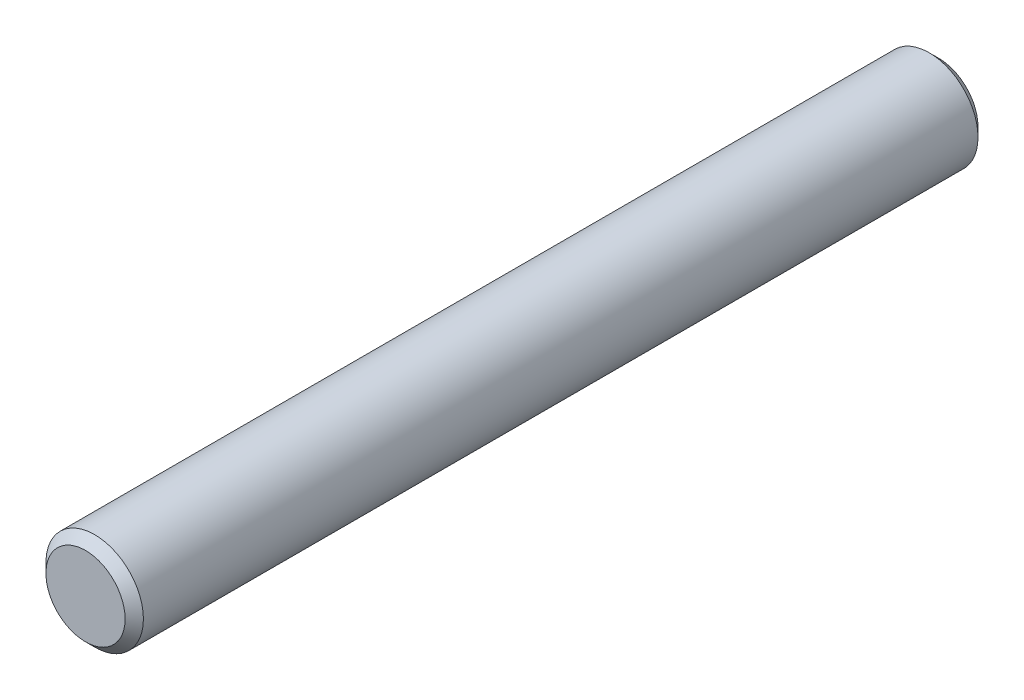
ISO-10303-21;
HEADER;
FILE_DESCRIPTION(('STEP AP214'),'2;1');
FILE_NAME('part.step','',(''),(''),'','','');
FILE_SCHEMA(('AUTOMOTIVE_DESIGN { 1 0 10303 214 1 1 1 1 }'));
ENDSEC;
DATA;
#1=APPLICATION_CONTEXT('core data for automotive mechanical design processes');
#2=APPLICATION_PROTOCOL_DEFINITION('international standard','automotive_design',2000,#1);
#3=PRODUCT_CONTEXT('',#1,'mechanical');
#4=PRODUCT('Part','Part','',(#3));
#5=PRODUCT_RELATED_PRODUCT_CATEGORY('part','',(#4));
#6=PRODUCT_DEFINITION_FORMATION('','',#4);
#7=PRODUCT_DEFINITION_CONTEXT('part definition',#1,'design');
#8=PRODUCT_DEFINITION('design','',#6,#7);
#9=PRODUCT_DEFINITION_SHAPE('','',#8);
#10=(LENGTH_UNIT() NAMED_UNIT(*) SI_UNIT(.MILLI.,.METRE.));
#11=(NAMED_UNIT(*) PLANE_ANGLE_UNIT() SI_UNIT($,.RADIAN.));
#12=(NAMED_UNIT(*) SI_UNIT($,.STERADIAN.) SOLID_ANGLE_UNIT());
#13=UNCERTAINTY_MEASURE_WITH_UNIT(LENGTH_MEASURE(1.E-05),#10,'distance_accuracy_value','');
#14=(GEOMETRIC_REPRESENTATION_CONTEXT(3) GLOBAL_UNCERTAINTY_ASSIGNED_CONTEXT((#13)) GLOBAL_UNIT_ASSIGNED_CONTEXT((#10,
#11,#12)) REPRESENTATION_CONTEXT('',''));
#15=CARTESIAN_POINT('',(0.,0.,0.));
#16=DIRECTION('',(0.,0.,1.));
#17=DIRECTION('',(1.,0.,0.));
#18=AXIS2_PLACEMENT_3D('',#15,#16,#17);
#19=CARTESIAN_POINT('',(0.,0.,70.));
#20=DIRECTION('',(0.,0.,-1.));
#21=DIRECTION('',(-1.,0.,0.));
#22=AXIS2_PLACEMENT_3D('',#19,#20,#21);
#23=CYLINDRICAL_SURFACE('',#22,4.);
#24=CARTESIAN_POINT('',(0.,0.,0.749999999999987));
#25=DIRECTION('',(0.,0.,1.));
#26=DIRECTION('',(1.,0.,0.));
#27=AXIS2_PLACEMENT_3D('',#24,#25,#26);
#28=CIRCLE('',#27,4.);
#29=CARTESIAN_POINT('',(4.,0.,0.749999999999987));
#30=VERTEX_POINT('',#29);
#31=EDGE_CURVE('E51',#30,#30,#28,.T.);
#32=ORIENTED_EDGE('',*,*,#31,.T.);
#33=EDGE_LOOP('',(#32));
#34=FACE_BOUND('',#33,.T.);
#35=CARTESIAN_POINT('',(0.,0.,69.25));
#36=DIRECTION('',(0.,0.,1.));
#37=DIRECTION('',(1.,0.,0.));
#38=AXIS2_PLACEMENT_3D('',#35,#36,#37);
#39=CIRCLE('',#38,4.);
#40=CARTESIAN_POINT('',(4.,0.,69.25));
#41=VERTEX_POINT('',#40);
#42=EDGE_CURVE('E54',#41,#41,#39,.F.);
#43=ORIENTED_EDGE('',*,*,#42,.T.);
#44=EDGE_LOOP('',(#43));
#45=FACE_BOUND('',#44,.T.);
#46=ADVANCED_FACE('F39',(#34,#45),#23,.T.);
#47=CARTESIAN_POINT('',(0.,0.,70.));
#48=DIRECTION('',(0.,0.,1.));
#49=DIRECTION('',(1.,0.,0.));
#50=AXIS2_PLACEMENT_3D('',#47,#48,#49);
#51=PLANE('',#50);
#52=CARTESIAN_POINT('',(0.,0.,70.));
#53=DIRECTION('',(0.,0.,1.));
#54=DIRECTION('',(1.,0.,0.));
#55=AXIS2_PLACEMENT_3D('',#52,#53,#54);
#56=CIRCLE('',#55,3.24999999999998);
#57=CARTESIAN_POINT('',(3.24999999999998,0.,70.));
#58=VERTEX_POINT('',#57);
#59=EDGE_CURVE('E10',#58,#58,#56,.T.);
#60=ORIENTED_EDGE('',*,*,#59,.T.);
#61=EDGE_LOOP('',(#60));
#62=FACE_BOUND('',#61,.T.);
#63=ADVANCED_FACE('F72',(#62),#51,.T.);
#64=CARTESIAN_POINT('',(0.,0.,0.));
#65=DIRECTION('',(0.,0.,1.));
#66=DIRECTION('',(1.,0.,0.));
#67=AXIS2_PLACEMENT_3D('',#64,#65,#66);
#68=PLANE('',#67);
#69=CARTESIAN_POINT('',(0.,0.,0.));
#70=DIRECTION('',(0.,0.,1.));
#71=DIRECTION('',(1.,0.,0.));
#72=AXIS2_PLACEMENT_3D('',#69,#70,#71);
#73=CIRCLE('',#72,3.25);
#74=CARTESIAN_POINT('',(3.25,0.,0.));
#75=VERTEX_POINT('',#74);
#76=EDGE_CURVE('E50',#75,#75,#73,.F.);
#77=ORIENTED_EDGE('',*,*,#76,.T.);
#78=EDGE_LOOP('',(#77));
#79=FACE_BOUND('',#78,.T.);
#80=ADVANCED_FACE('F70',(#79),#68,.F.);
#81=CARTESIAN_POINT('',(0.,0.,0.749999999999987));
#82=DIRECTION('',(0.,0.,1.));
#83=DIRECTION('',(1.,0.,0.));
#84=AXIS2_PLACEMENT_3D('',#81,#82,#83);
#85=CONICAL_SURFACE('',#84,4.,0.785398163397455);
#86=ORIENTED_EDGE('',*,*,#76,.F.);
#87=EDGE_LOOP('',(#86));
#88=FACE_BOUND('',#87,.T.);
#89=ORIENTED_EDGE('',*,*,#31,.F.);
#90=EDGE_LOOP('',(#89));
#91=FACE_BOUND('',#90,.T.);
#92=ADVANCED_FACE('F63',(#88,#91),#85,.T.);
#93=CARTESIAN_POINT('',(0.,0.,70.));
#94=DIRECTION('',(0.,0.,-1.));
#95=DIRECTION('',(-1.,0.,0.));
#96=AXIS2_PLACEMENT_3D('',#93,#94,#95);
#97=CONICAL_SURFACE('',#96,3.24999999999998,0.785398163397441);
#98=ORIENTED_EDGE('',*,*,#42,.F.);
#99=EDGE_LOOP('',(#98));
#100=FACE_BOUND('',#99,.T.);
#101=ORIENTED_EDGE('',*,*,#59,.F.);
#102=EDGE_LOOP('',(#101));
#103=FACE_BOUND('',#102,.T.);
#104=ADVANCED_FACE('F45',(#100,#103),#97,.T.);
#105=CLOSED_SHELL('',(#46,#63,#80,#92,#104));
#106=MANIFOLD_SOLID_BREP('B2',#105);
#107=ADVANCED_BREP_SHAPE_REPRESENTATION('',(#18,#106),#14);
#108=SHAPE_DEFINITION_REPRESENTATION(#9,#107);
ENDSEC;
END-ISO-10303-21;
